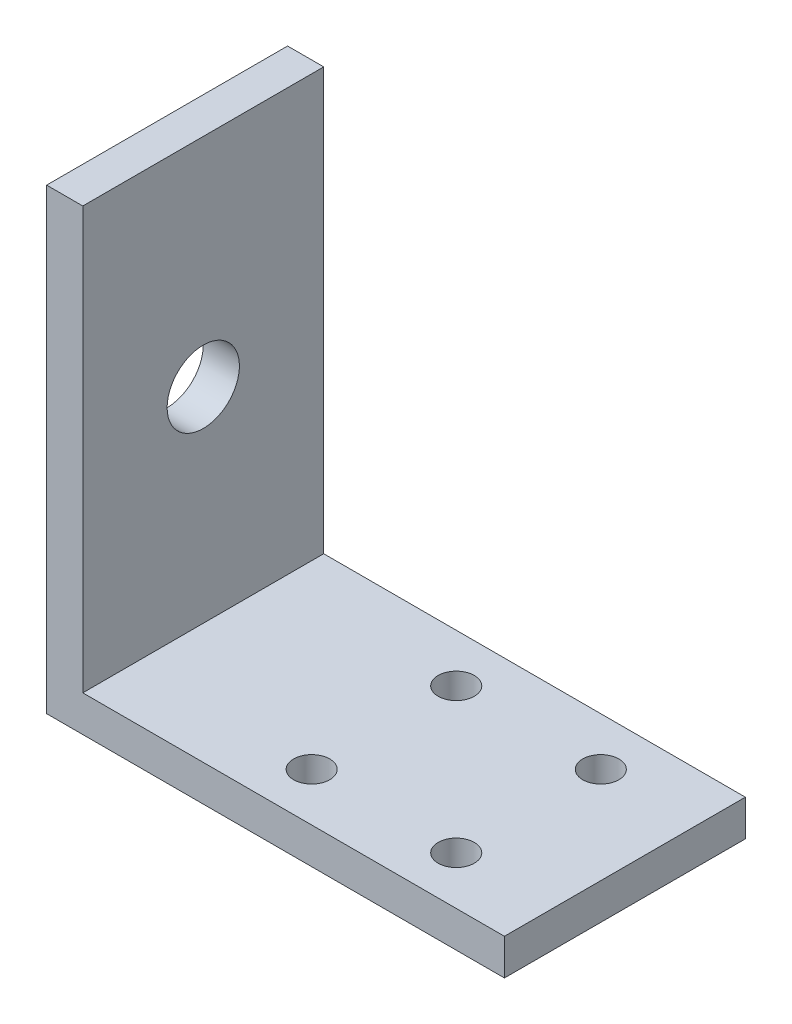
ISO-10303-21;
HEADER;
FILE_DESCRIPTION(('STEP AP214'),'2;1');
FILE_NAME('part.step','',(''),(''),'','','');
FILE_SCHEMA(('AUTOMOTIVE_DESIGN { 1 0 10303 214 1 1 1 1 }'));
ENDSEC;
DATA;
#1=APPLICATION_CONTEXT('core data for automotive mechanical design processes');
#2=APPLICATION_PROTOCOL_DEFINITION('international standard','automotive_design',2000,#1);
#3=PRODUCT_CONTEXT('',#1,'mechanical');
#4=PRODUCT('Part','Part','',(#3));
#5=PRODUCT_RELATED_PRODUCT_CATEGORY('part','',(#4));
#6=PRODUCT_DEFINITION_FORMATION('','',#4);
#7=PRODUCT_DEFINITION_CONTEXT('part definition',#1,'design');
#8=PRODUCT_DEFINITION('design','',#6,#7);
#9=PRODUCT_DEFINITION_SHAPE('','',#8);
#10=(LENGTH_UNIT() NAMED_UNIT(*) SI_UNIT(.MILLI.,.METRE.));
#11=(NAMED_UNIT(*) PLANE_ANGLE_UNIT() SI_UNIT($,.RADIAN.));
#12=(NAMED_UNIT(*) SI_UNIT($,.STERADIAN.) SOLID_ANGLE_UNIT());
#13=UNCERTAINTY_MEASURE_WITH_UNIT(LENGTH_MEASURE(1.E-05),#10,'distance_accuracy_value','');
#14=(GEOMETRIC_REPRESENTATION_CONTEXT(3) GLOBAL_UNCERTAINTY_ASSIGNED_CONTEXT((#13)) GLOBAL_UNIT_ASSIGNED_CONTEXT((#10,
#11,#12)) REPRESENTATION_CONTEXT('',''));
#15=CARTESIAN_POINT('',(0.,0.,0.));
#16=DIRECTION('',(0.,0.,1.));
#17=DIRECTION('',(1.,0.,0.));
#18=AXIS2_PLACEMENT_3D('',#15,#16,#17);
#19=CARTESIAN_POINT('',(38.,0.,20.));
#20=DIRECTION('',(0.,1.,0.));
#21=DIRECTION('',(0.,0.,1.));
#22=AXIS2_PLACEMENT_3D('',#19,#20,#21);
#23=PLANE('',#22);
#24=CARTESIAN_POINT('',(18.,0.,16.));
#25=DIRECTION('',(0.,1.,0.));
#26=DIRECTION('',(0.,0.,1.));
#27=AXIS2_PLACEMENT_3D('',#24,#25,#26);
#28=CIRCLE('',#27,1.5);
#29=CARTESIAN_POINT('',(18.,0.,17.5));
#30=VERTEX_POINT('',#29);
#31=EDGE_CURVE('E165',#30,#30,#28,.T.);
#32=ORIENTED_EDGE('',*,*,#31,.T.);
#33=EDGE_LOOP('',(#32));
#34=FACE_BOUND('',#33,.T.);
#35=CARTESIAN_POINT('',(30.,0.,4.));
#36=DIRECTION('',(0.,1.,0.));
#37=DIRECTION('',(0.,0.,1.));
#38=AXIS2_PLACEMENT_3D('',#35,#36,#37);
#39=CIRCLE('',#38,1.50000000000001);
#40=CARTESIAN_POINT('',(30.,0.,5.50000000000001));
#41=VERTEX_POINT('',#40);
#42=EDGE_CURVE('E169',#41,#41,#39,.T.);
#43=ORIENTED_EDGE('',*,*,#42,.T.);
#44=EDGE_LOOP('',(#43));
#45=FACE_BOUND('',#44,.T.);
#46=CARTESIAN_POINT('',(30.,0.,16.));
#47=DIRECTION('',(0.,1.,0.));
#48=DIRECTION('',(0.,0.,1.));
#49=AXIS2_PLACEMENT_3D('',#46,#47,#48);
#50=CIRCLE('',#49,1.50000000000001);
#51=CARTESIAN_POINT('',(30.,0.,17.5));
#52=VERTEX_POINT('',#51);
#53=EDGE_CURVE('E173',#52,#52,#50,.T.);
#54=ORIENTED_EDGE('',*,*,#53,.T.);
#55=EDGE_LOOP('',(#54));
#56=FACE_BOUND('',#55,.T.);
#57=CARTESIAN_POINT('',(18.,0.,4.));
#58=DIRECTION('',(0.,1.,0.));
#59=DIRECTION('',(0.,0.,1.));
#60=AXIS2_PLACEMENT_3D('',#57,#58,#59);
#61=CIRCLE('',#60,1.5);
#62=CARTESIAN_POINT('',(18.,0.,5.5));
#63=VERTEX_POINT('',#62);
#64=EDGE_CURVE('E176',#63,#63,#61,.T.);
#65=ORIENTED_EDGE('',*,*,#64,.T.);
#66=EDGE_LOOP('',(#65));
#67=FACE_BOUND('',#66,.T.);
#68=DIRECTION('',(1.,0.,0.));
#69=VECTOR('',#68,1.);
#70=CARTESIAN_POINT('',(38.,0.,0.));
#71=LINE('',#70,#69);
#72=CARTESIAN_POINT('',(0.,0.,0.));
#73=VERTEX_POINT('',#72);
#74=CARTESIAN_POINT('',(38.,0.,0.));
#75=VERTEX_POINT('',#74);
#76=EDGE_CURVE('E117',#73,#75,#71,.T.);
#77=ORIENTED_EDGE('',*,*,#76,.T.);
#78=DIRECTION('',(0.,0.,-1.));
#79=VECTOR('',#78,1.);
#80=CARTESIAN_POINT('',(38.,0.,20.));
#81=LINE('',#80,#79);
#82=CARTESIAN_POINT('',(38.,0.,20.));
#83=VERTEX_POINT('',#82);
#84=EDGE_CURVE('E11',#83,#75,#81,.T.);
#85=ORIENTED_EDGE('',*,*,#84,.F.);
#86=DIRECTION('',(1.,0.,0.));
#87=VECTOR('',#86,1.);
#88=CARTESIAN_POINT('',(38.,0.,20.));
#89=LINE('',#88,#87);
#90=CARTESIAN_POINT('',(0.,0.,20.));
#91=VERTEX_POINT('',#90);
#92=EDGE_CURVE('E128',#91,#83,#89,.T.);
#93=ORIENTED_EDGE('',*,*,#92,.F.);
#94=DIRECTION('',(0.,0.,-1.));
#95=VECTOR('',#94,1.);
#96=CARTESIAN_POINT('',(0.,0.,20.));
#97=LINE('',#96,#95);
#98=EDGE_CURVE('E113',#91,#73,#97,.T.);
#99=ORIENTED_EDGE('',*,*,#98,.T.);
#100=EDGE_LOOP('',(#77,#85,#93,#99));
#101=FACE_BOUND('',#100,.T.);
#102=ADVANCED_FACE('F33',(#34,#45,#56,#67,#101),#23,.F.);
#103=CARTESIAN_POINT('',(38.,2.99999999999999,20.));
#104=DIRECTION('',(-1.,0.,0.));
#105=DIRECTION('',(0.,0.,1.));
#106=AXIS2_PLACEMENT_3D('',#103,#104,#105);
#107=PLANE('',#106);
#108=DIRECTION('',(0.,1.,0.));
#109=VECTOR('',#108,1.);
#110=CARTESIAN_POINT('',(38.,2.99999999999999,0.));
#111=LINE('',#110,#109);
#112=CARTESIAN_POINT('',(38.,2.99999999999999,0.));
#113=VERTEX_POINT('',#112);
#114=EDGE_CURVE('E120',#75,#113,#111,.T.);
#115=ORIENTED_EDGE('',*,*,#114,.T.);
#116=DIRECTION('',(0.,0.,-1.));
#117=VECTOR('',#116,1.);
#118=CARTESIAN_POINT('',(38.,2.99999999999999,20.));
#119=LINE('',#118,#117);
#120=CARTESIAN_POINT('',(38.,2.99999999999999,20.));
#121=VERTEX_POINT('',#120);
#122=EDGE_CURVE('E41',#121,#113,#119,.T.);
#123=ORIENTED_EDGE('',*,*,#122,.F.);
#124=DIRECTION('',(0.,1.,0.));
#125=VECTOR('',#124,1.);
#126=CARTESIAN_POINT('',(38.,2.99999999999999,20.));
#127=LINE('',#126,#125);
#128=EDGE_CURVE('E86',#83,#121,#127,.T.);
#129=ORIENTED_EDGE('',*,*,#128,.F.);
#130=ORIENTED_EDGE('',*,*,#84,.T.);
#131=EDGE_LOOP('',(#115,#123,#129,#130));
#132=FACE_BOUND('',#131,.T.);
#133=ADVANCED_FACE('F156',(#132),#107,.F.);
#134=CARTESIAN_POINT('',(3.,2.99999999999999,20.));
#135=DIRECTION('',(0.,-1.,0.));
#136=DIRECTION('',(0.,0.,-1.));
#137=AXIS2_PLACEMENT_3D('',#134,#135,#136);
#138=PLANE('',#137);
#139=CARTESIAN_POINT('',(18.,2.99999999999999,16.));
#140=DIRECTION('',(0.,1.,0.));
#141=DIRECTION('',(0.,0.,1.));
#142=AXIS2_PLACEMENT_3D('',#139,#140,#141);
#143=CIRCLE('',#142,1.5);
#144=CARTESIAN_POINT('',(18.,2.99999999999999,17.5));
#145=VERTEX_POINT('',#144);
#146=EDGE_CURVE('E221',#145,#145,#143,.T.);
#147=ORIENTED_EDGE('',*,*,#146,.F.);
#148=EDGE_LOOP('',(#147));
#149=FACE_BOUND('',#148,.T.);
#150=CARTESIAN_POINT('',(30.,2.99999999999999,4.));
#151=DIRECTION('',(0.,1.,0.));
#152=DIRECTION('',(0.,0.,1.));
#153=AXIS2_PLACEMENT_3D('',#150,#151,#152);
#154=CIRCLE('',#153,1.50000000000001);
#155=CARTESIAN_POINT('',(30.,2.99999999999999,5.50000000000001));
#156=VERTEX_POINT('',#155);
#157=EDGE_CURVE('E225',#156,#156,#154,.T.);
#158=ORIENTED_EDGE('',*,*,#157,.F.);
#159=EDGE_LOOP('',(#158));
#160=FACE_BOUND('',#159,.T.);
#161=CARTESIAN_POINT('',(30.,2.99999999999999,16.));
#162=DIRECTION('',(0.,1.,0.));
#163=DIRECTION('',(0.,0.,1.));
#164=AXIS2_PLACEMENT_3D('',#161,#162,#163);
#165=CIRCLE('',#164,1.50000000000001);
#166=CARTESIAN_POINT('',(30.,2.99999999999999,17.5));
#167=VERTEX_POINT('',#166);
#168=EDGE_CURVE('E186',#167,#167,#165,.T.);
#169=ORIENTED_EDGE('',*,*,#168,.F.);
#170=EDGE_LOOP('',(#169));
#171=FACE_BOUND('',#170,.T.);
#172=CARTESIAN_POINT('',(18.,2.99999999999999,4.));
#173=DIRECTION('',(0.,1.,0.));
#174=DIRECTION('',(0.,0.,1.));
#175=AXIS2_PLACEMENT_3D('',#172,#173,#174);
#176=CIRCLE('',#175,1.5);
#177=CARTESIAN_POINT('',(18.,2.99999999999999,5.5));
#178=VERTEX_POINT('',#177);
#179=EDGE_CURVE('E179',#178,#178,#176,.T.);
#180=ORIENTED_EDGE('',*,*,#179,.F.);
#181=EDGE_LOOP('',(#180));
#182=FACE_BOUND('',#181,.T.);
#183=DIRECTION('',(-1.,0.,0.));
#184=VECTOR('',#183,1.);
#185=CARTESIAN_POINT('',(3.,2.99999999999999,0.));
#186=LINE('',#185,#184);
#187=CARTESIAN_POINT('',(3.,2.99999999999999,0.));
#188=VERTEX_POINT('',#187);
#189=EDGE_CURVE('E123',#113,#188,#186,.T.);
#190=ORIENTED_EDGE('',*,*,#189,.T.);
#191=DIRECTION('',(0.,0.,-1.));
#192=VECTOR('',#191,1.);
#193=CARTESIAN_POINT('',(3.,2.99999999999999,20.));
#194=LINE('',#193,#192);
#195=CARTESIAN_POINT('',(3.,2.99999999999999,20.));
#196=VERTEX_POINT('',#195);
#197=EDGE_CURVE('E108',#196,#188,#194,.T.);
#198=ORIENTED_EDGE('',*,*,#197,.F.);
#199=DIRECTION('',(-1.,0.,0.));
#200=VECTOR('',#199,1.);
#201=CARTESIAN_POINT('',(3.,2.99999999999999,20.));
#202=LINE('',#201,#200);
#203=EDGE_CURVE('E99',#121,#196,#202,.T.);
#204=ORIENTED_EDGE('',*,*,#203,.F.);
#205=ORIENTED_EDGE('',*,*,#122,.T.);
#206=EDGE_LOOP('',(#190,#198,#204,#205));
#207=FACE_BOUND('',#206,.T.);
#208=ADVANCED_FACE('F134',(#149,#160,#171,#182,#207),#138,.F.);
#209=CARTESIAN_POINT('',(3.,38.,20.));
#210=DIRECTION('',(-1.,0.,0.));
#211=DIRECTION('',(0.,0.,1.));
#212=AXIS2_PLACEMENT_3D('',#209,#210,#211);
#213=PLANE('',#212);
#214=CARTESIAN_POINT('',(3.,20.,10.));
#215=DIRECTION('',(-1.,0.,0.));
#216=DIRECTION('',(0.,0.,1.));
#217=AXIS2_PLACEMENT_3D('',#214,#215,#216);
#218=CIRCLE('',#217,3.);
#219=CARTESIAN_POINT('',(3.,20.,13.));
#220=VERTEX_POINT('',#219);
#221=EDGE_CURVE('E121',#220,#220,#218,.T.);
#222=ORIENTED_EDGE('',*,*,#221,.T.);
#223=EDGE_LOOP('',(#222));
#224=FACE_BOUND('',#223,.T.);
#225=DIRECTION('',(0.,1.,0.));
#226=VECTOR('',#225,1.);
#227=CARTESIAN_POINT('',(3.,38.,0.));
#228=LINE('',#227,#226);
#229=CARTESIAN_POINT('',(3.,38.,0.));
#230=VERTEX_POINT('',#229);
#231=EDGE_CURVE('E107',#188,#230,#228,.T.);
#232=ORIENTED_EDGE('',*,*,#231,.T.);
#233=DIRECTION('',(0.,0.,-1.));
#234=VECTOR('',#233,1.);
#235=CARTESIAN_POINT('',(3.,38.,20.));
#236=LINE('',#235,#234);
#237=CARTESIAN_POINT('',(3.,38.,20.));
#238=VERTEX_POINT('',#237);
#239=EDGE_CURVE('E104',#238,#230,#236,.T.);
#240=ORIENTED_EDGE('',*,*,#239,.F.);
#241=DIRECTION('',(0.,1.,0.));
#242=VECTOR('',#241,1.);
#243=CARTESIAN_POINT('',(3.,38.,20.));
#244=LINE('',#243,#242);
#245=EDGE_CURVE('E93',#196,#238,#244,.T.);
#246=ORIENTED_EDGE('',*,*,#245,.F.);
#247=ORIENTED_EDGE('',*,*,#197,.T.);
#248=EDGE_LOOP('',(#232,#240,#246,#247));
#249=FACE_BOUND('',#248,.T.);
#250=ADVANCED_FACE('F105',(#224,#249),#213,.F.);
#251=CARTESIAN_POINT('',(0.,38.,20.));
#252=DIRECTION('',(0.,-1.,0.));
#253=DIRECTION('',(0.,0.,-1.));
#254=AXIS2_PLACEMENT_3D('',#251,#252,#253);
#255=PLANE('',#254);
#256=DIRECTION('',(-1.,0.,0.));
#257=VECTOR('',#256,1.);
#258=CARTESIAN_POINT('',(0.,38.,0.));
#259=LINE('',#258,#257);
#260=CARTESIAN_POINT('',(0.,38.,0.));
#261=VERTEX_POINT('',#260);
#262=EDGE_CURVE('E72',#230,#261,#259,.T.);
#263=ORIENTED_EDGE('',*,*,#262,.T.);
#264=DIRECTION('',(0.,0.,-1.));
#265=VECTOR('',#264,1.);
#266=CARTESIAN_POINT('',(0.,38.,20.));
#267=LINE('',#266,#265);
#268=CARTESIAN_POINT('',(0.,38.,20.));
#269=VERTEX_POINT('',#268);
#270=EDGE_CURVE('E109',#269,#261,#267,.T.);
#271=ORIENTED_EDGE('',*,*,#270,.F.);
#272=DIRECTION('',(-1.,0.,0.));
#273=VECTOR('',#272,1.);
#274=CARTESIAN_POINT('',(0.,38.,20.));
#275=LINE('',#274,#273);
#276=EDGE_CURVE('E97',#238,#269,#275,.T.);
#277=ORIENTED_EDGE('',*,*,#276,.F.);
#278=ORIENTED_EDGE('',*,*,#239,.T.);
#279=EDGE_LOOP('',(#263,#271,#277,#278));
#280=FACE_BOUND('',#279,.T.);
#281=ADVANCED_FACE('F111',(#280),#255,.F.);
#282=CARTESIAN_POINT('',(0.,0.,20.));
#283=DIRECTION('',(1.,0.,0.));
#284=DIRECTION('',(0.,0.,-1.));
#285=AXIS2_PLACEMENT_3D('',#282,#283,#284);
#286=PLANE('',#285);
#287=CARTESIAN_POINT('',(0.,20.,10.));
#288=DIRECTION('',(-1.,0.,0.));
#289=DIRECTION('',(0.,0.,1.));
#290=AXIS2_PLACEMENT_3D('',#287,#288,#289);
#291=CIRCLE('',#290,3.);
#292=CARTESIAN_POINT('',(0.,20.,13.));
#293=VERTEX_POINT('',#292);
#294=EDGE_CURVE('E178',#293,#293,#291,.T.);
#295=ORIENTED_EDGE('',*,*,#294,.F.);
#296=EDGE_LOOP('',(#295));
#297=FACE_BOUND('',#296,.T.);
#298=DIRECTION('',(0.,-1.,0.));
#299=VECTOR('',#298,1.);
#300=CARTESIAN_POINT('',(0.,0.,0.));
#301=LINE('',#300,#299);
#302=EDGE_CURVE('E78',#261,#73,#301,.T.);
#303=ORIENTED_EDGE('',*,*,#302,.T.);
#304=ORIENTED_EDGE('',*,*,#98,.F.);
#305=DIRECTION('',(0.,-1.,0.));
#306=VECTOR('',#305,1.);
#307=CARTESIAN_POINT('',(0.,0.,20.));
#308=LINE('',#307,#306);
#309=EDGE_CURVE('E49',#269,#91,#308,.T.);
#310=ORIENTED_EDGE('',*,*,#309,.F.);
#311=ORIENTED_EDGE('',*,*,#270,.T.);
#312=EDGE_LOOP('',(#303,#304,#310,#311));
#313=FACE_BOUND('',#312,.T.);
#314=ADVANCED_FACE('F141',(#297,#313),#286,.F.);
#315=CARTESIAN_POINT('',(0.,0.,20.));
#316=DIRECTION('',(0.,0.,-1.));
#317=DIRECTION('',(-1.,0.,0.));
#318=AXIS2_PLACEMENT_3D('',#315,#316,#317);
#319=PLANE('',#318);
#320=ORIENTED_EDGE('',*,*,#92,.T.);
#321=ORIENTED_EDGE('',*,*,#128,.T.);
#322=ORIENTED_EDGE('',*,*,#203,.T.);
#323=ORIENTED_EDGE('',*,*,#245,.T.);
#324=ORIENTED_EDGE('',*,*,#276,.T.);
#325=ORIENTED_EDGE('',*,*,#309,.T.);
#326=EDGE_LOOP('',(#320,#321,#322,#323,#324,#325));
#327=FACE_BOUND('',#326,.T.);
#328=ADVANCED_FACE('F95',(#327),#319,.F.);
#329=CARTESIAN_POINT('',(0.,0.,0.));
#330=DIRECTION('',(0.,0.,-1.));
#331=DIRECTION('',(-1.,0.,0.));
#332=AXIS2_PLACEMENT_3D('',#329,#330,#331);
#333=PLANE('',#332);
#334=ORIENTED_EDGE('',*,*,#76,.F.);
#335=ORIENTED_EDGE('',*,*,#302,.F.);
#336=ORIENTED_EDGE('',*,*,#262,.F.);
#337=ORIENTED_EDGE('',*,*,#231,.F.);
#338=ORIENTED_EDGE('',*,*,#189,.F.);
#339=ORIENTED_EDGE('',*,*,#114,.F.);
#340=EDGE_LOOP('',(#334,#335,#336,#337,#338,#339));
#341=FACE_BOUND('',#340,.T.);
#342=ADVANCED_FACE('F137',(#341),#333,.T.);
#343=CARTESIAN_POINT('',(38.,20.,10.));
#344=DIRECTION('',(-1.,0.,0.));
#345=DIRECTION('',(0.,0.,1.));
#346=AXIS2_PLACEMENT_3D('',#343,#344,#345);
#347=CYLINDRICAL_SURFACE('',#346,3.);
#348=ORIENTED_EDGE('',*,*,#294,.T.);
#349=EDGE_LOOP('',(#348));
#350=FACE_BOUND('',#349,.T.);
#351=ORIENTED_EDGE('',*,*,#221,.F.);
#352=EDGE_LOOP('',(#351));
#353=FACE_BOUND('',#352,.T.);
#354=ADVANCED_FACE('F195',(#350,#353),#347,.F.);
#355=CARTESIAN_POINT('',(18.,0.,4.));
#356=DIRECTION('',(0.,1.,0.));
#357=DIRECTION('',(0.,0.,1.));
#358=AXIS2_PLACEMENT_3D('',#355,#356,#357);
#359=CYLINDRICAL_SURFACE('',#358,1.5);
#360=ORIENTED_EDGE('',*,*,#64,.F.);
#361=EDGE_LOOP('',(#360));
#362=FACE_BOUND('',#361,.T.);
#363=ORIENTED_EDGE('',*,*,#179,.T.);
#364=EDGE_LOOP('',(#363));
#365=FACE_BOUND('',#364,.T.);
#366=ADVANCED_FACE('F197',(#362,#365),#359,.F.);
#367=CARTESIAN_POINT('',(30.,0.,16.));
#368=DIRECTION('',(0.,1.,0.));
#369=DIRECTION('',(0.,0.,1.));
#370=AXIS2_PLACEMENT_3D('',#367,#368,#369);
#371=CYLINDRICAL_SURFACE('',#370,1.50000000000001);
#372=ORIENTED_EDGE('',*,*,#53,.F.);
#373=EDGE_LOOP('',(#372));
#374=FACE_BOUND('',#373,.T.);
#375=ORIENTED_EDGE('',*,*,#168,.T.);
#376=EDGE_LOOP('',(#375));
#377=FACE_BOUND('',#376,.T.);
#378=ADVANCED_FACE('F203',(#374,#377),#371,.F.);
#379=CARTESIAN_POINT('',(30.,0.,4.));
#380=DIRECTION('',(0.,1.,0.));
#381=DIRECTION('',(0.,0.,1.));
#382=AXIS2_PLACEMENT_3D('',#379,#380,#381);
#383=CYLINDRICAL_SURFACE('',#382,1.50000000000001);
#384=ORIENTED_EDGE('',*,*,#42,.F.);
#385=EDGE_LOOP('',(#384));
#386=FACE_BOUND('',#385,.T.);
#387=ORIENTED_EDGE('',*,*,#157,.T.);
#388=EDGE_LOOP('',(#387));
#389=FACE_BOUND('',#388,.T.);
#390=ADVANCED_FACE('F208',(#386,#389),#383,.F.);
#391=CARTESIAN_POINT('',(18.,0.,16.));
#392=DIRECTION('',(0.,1.,0.));
#393=DIRECTION('',(0.,0.,1.));
#394=AXIS2_PLACEMENT_3D('',#391,#392,#393);
#395=CYLINDRICAL_SURFACE('',#394,1.5);
#396=ORIENTED_EDGE('',*,*,#31,.F.);
#397=EDGE_LOOP('',(#396));
#398=FACE_BOUND('',#397,.T.);
#399=ORIENTED_EDGE('',*,*,#146,.T.);
#400=EDGE_LOOP('',(#399));
#401=FACE_BOUND('',#400,.T.);
#402=ADVANCED_FACE('F212',(#398,#401),#395,.F.);
#403=CLOSED_SHELL('',(#102,#133,#208,#250,#281,#314,#328,#342,#354,#366,#378,#390,#402));
#404=MANIFOLD_SOLID_BREP('B2',#403);
#405=ADVANCED_BREP_SHAPE_REPRESENTATION('',(#18,#404),#14);
#406=SHAPE_DEFINITION_REPRESENTATION(#9,#405);
ENDSEC;
END-ISO-10303-21;
